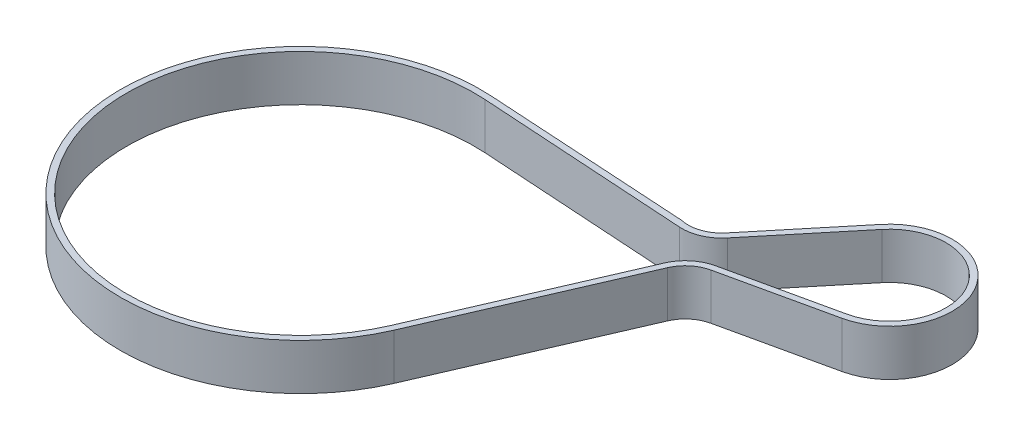
ISO-10303-21;
HEADER;
FILE_DESCRIPTION(('STEP AP214'),'2;1');
FILE_NAME('part.step','',(''),(''),'','','');
FILE_SCHEMA(('AUTOMOTIVE_DESIGN { 1 0 10303 214 1 1 1 1 }'));
ENDSEC;
DATA;
#1=APPLICATION_CONTEXT('core data for automotive mechanical design processes');
#2=APPLICATION_PROTOCOL_DEFINITION('international standard','automotive_design',2000,#1);
#3=PRODUCT_CONTEXT('',#1,'mechanical');
#4=PRODUCT('Part','Part','',(#3));
#5=PRODUCT_RELATED_PRODUCT_CATEGORY('part','',(#4));
#6=PRODUCT_DEFINITION_FORMATION('','',#4);
#7=PRODUCT_DEFINITION_CONTEXT('part definition',#1,'design');
#8=PRODUCT_DEFINITION('design','',#6,#7);
#9=PRODUCT_DEFINITION_SHAPE('','',#8);
#10=(LENGTH_UNIT() NAMED_UNIT(*) SI_UNIT(.MILLI.,.METRE.));
#11=(NAMED_UNIT(*) PLANE_ANGLE_UNIT() SI_UNIT($,.RADIAN.));
#12=(NAMED_UNIT(*) SI_UNIT($,.STERADIAN.) SOLID_ANGLE_UNIT());
#13=UNCERTAINTY_MEASURE_WITH_UNIT(LENGTH_MEASURE(1.E-05),#10,'distance_accuracy_value','');
#14=(GEOMETRIC_REPRESENTATION_CONTEXT(3) GLOBAL_UNCERTAINTY_ASSIGNED_CONTEXT((#13)) GLOBAL_UNIT_ASSIGNED_CONTEXT((#10,
#11,#12)) REPRESENTATION_CONTEXT('',''));
#15=CARTESIAN_POINT('',(0.,0.,0.));
#16=DIRECTION('',(0.,0.,1.));
#17=DIRECTION('',(1.,0.,0.));
#18=AXIS2_PLACEMENT_3D('',#15,#16,#17);
#19=CARTESIAN_POINT('',(37.0715224274978,7.,-24.207214546462));
#20=DIRECTION('',(0.,-1.,0.));
#21=DIRECTION('',(0.,0.,-1.));
#22=AXIS2_PLACEMENT_3D('',#19,#20,#21);
#23=CYLINDRICAL_SURFACE('',#22,9.17);
#24=CARTESIAN_POINT('',(37.0715224274978,0.,-24.207214546462));
#25=DIRECTION('',(0.,1.,0.));
#26=DIRECTION('',(0.,0.,1.));
#27=AXIS2_PLACEMENT_3D('',#24,#25,#26);
#28=CIRCLE('',#27,9.17);
#29=CARTESIAN_POINT('',(39.0527045898969,0.,-15.2537896576615));
#30=VERTEX_POINT('',#29);
#31=CARTESIAN_POINT('',(29.9994658756208,0.,-30.0445869114096));
#32=VERTEX_POINT('',#31);
#33=EDGE_CURVE('E263',#30,#32,#28,.T.);
#34=ORIENTED_EDGE('',*,*,#33,.F.);
#35=DIRECTION('',(0.,-1.,0.));
#36=VECTOR('',#35,1.);
#37=CARTESIAN_POINT('',(39.0527045898969,7.,-15.2537896576615));
#38=LINE('',#37,#36);
#39=CARTESIAN_POINT('',(39.0527045898969,7.5,-15.2537896576615));
#40=VERTEX_POINT('',#39);
#41=EDGE_CURVE('E11',#40,#30,#38,.T.);
#42=ORIENTED_EDGE('',*,*,#41,.F.);
#43=CARTESIAN_POINT('',(37.0715224274978,7.5,-24.207214546462));
#44=DIRECTION('',(0.,1.,0.));
#45=DIRECTION('',(0.,0.,1.));
#46=AXIS2_PLACEMENT_3D('',#43,#44,#45);
#47=CIRCLE('',#46,9.17000000000001);
#48=CARTESIAN_POINT('',(29.9994658756208,7.5,-30.0445869114096));
#49=VERTEX_POINT('',#48);
#50=EDGE_CURVE('E167',#40,#49,#47,.T.);
#51=ORIENTED_EDGE('',*,*,#50,.T.);
#52=DIRECTION('',(0.,-1.,0.));
#53=VECTOR('',#52,1.);
#54=CARTESIAN_POINT('',(29.9994658756208,7.,-30.0445869114096));
#55=LINE('',#54,#53);
#56=EDGE_CURVE('E61',#49,#32,#55,.T.);
#57=ORIENTED_EDGE('',*,*,#56,.T.);
#58=EDGE_LOOP('',(#34,#42,#51,#57));
#59=FACE_BOUND('',#58,.T.);
#60=ADVANCED_FACE('F43',(#59),#23,.F.);
#61=CARTESIAN_POINT('',(-1.39485950516736,7.,-6.30369586753306));
#62=DIRECTION('',(-0.216050399389213,0.,-0.976382212519135));
#63=DIRECTION('',(-0.976382212519135,0.,0.216050399389213));
#64=AXIS2_PLACEMENT_3D('',#61,#62,#63);
#65=PLANE('',#64);
#66=DIRECTION('',(0.976382212519135,0.,-0.216050399389213));
#67=VECTOR('',#66,1.);
#68=CARTESIAN_POINT('',(-1.39485950516736,0.,-6.30369586753306));
#69=LINE('',#68,#67);
#70=CARTESIAN_POINT('',(21.601634897573,0.,-11.3922787365768));
#71=VERTEX_POINT('',#70);
#72=EDGE_CURVE('E266',#71,#30,#69,.T.);
#73=ORIENTED_EDGE('',*,*,#72,.F.);
#74=DIRECTION('',(0.,-1.,0.));
#75=VECTOR('',#74,1.);
#76=CARTESIAN_POINT('',(21.601634897573,7.,-11.3922787365768));
#77=LINE('',#76,#75);
#78=CARTESIAN_POINT('',(21.601634897573,7.5,-11.3922787365768));
#79=VERTEX_POINT('',#78);
#80=EDGE_CURVE('E53',#79,#71,#77,.T.);
#81=ORIENTED_EDGE('',*,*,#80,.F.);
#82=DIRECTION('',(0.976382212519135,0.,-0.216050399389213));
#83=VECTOR('',#82,1.);
#84=CARTESIAN_POINT('',(21.601634897573,7.5,-11.3922787365768));
#85=LINE('',#84,#83);
#86=EDGE_CURVE('E198',#79,#40,#85,.T.);
#87=ORIENTED_EDGE('',*,*,#86,.T.);
#88=ORIENTED_EDGE('',*,*,#41,.T.);
#89=EDGE_LOOP('',(#73,#81,#87,#88));
#90=FACE_BOUND('',#89,.T.);
#91=ADVANCED_FACE('F372',(#90),#65,.T.);
#92=CARTESIAN_POINT('',(23.0059624936029,7.,-5.04579435520239));
#93=DIRECTION('',(0.,-1.,0.));
#94=DIRECTION('',(0.,0.,-1.));
#95=AXIS2_PLACEMENT_3D('',#92,#93,#94);
#96=CYLINDRICAL_SURFACE('',#95,6.5);
#97=CARTESIAN_POINT('',(23.0059624936029,0.,-5.04579435520239));
#98=DIRECTION('',(0.,1.,0.));
#99=DIRECTION('',(0.,0.,1.));
#100=AXIS2_PLACEMENT_3D('',#97,#98,#99);
#101=CIRCLE('',#100,6.5);
#102=CARTESIAN_POINT('',(17.0413153761302,0.,-7.62900645722272));
#103=VERTEX_POINT('',#102);
#104=EDGE_CURVE('E270',#71,#103,#101,.T.);
#105=ORIENTED_EDGE('',*,*,#104,.T.);
#106=DIRECTION('',(0.,-1.,0.));
#107=VECTOR('',#106,1.);
#108=CARTESIAN_POINT('',(17.0413153761302,7.,-7.62900645722272));
#109=LINE('',#108,#107);
#110=CARTESIAN_POINT('',(17.0413153761302,7.5,-7.62900645722273));
#111=VERTEX_POINT('',#110);
#112=EDGE_CURVE('E304',#111,#103,#109,.T.);
#113=ORIENTED_EDGE('',*,*,#112,.F.);
#114=CARTESIAN_POINT('',(23.0059624936029,7.5,-5.04579435520239));
#115=DIRECTION('',(0.,-1.,0.));
#116=DIRECTION('',(0.,0.,1.));
#117=AXIS2_PLACEMENT_3D('',#114,#115,#116);
#118=CIRCLE('',#117,6.5);
#119=EDGE_CURVE('E194',#111,#79,#118,.T.);
#120=ORIENTED_EDGE('',*,*,#119,.T.);
#121=ORIENTED_EDGE('',*,*,#80,.T.);
#122=EDGE_LOOP('',(#105,#113,#120,#121));
#123=FACE_BOUND('',#122,.T.);
#124=ADVANCED_FACE('F377',(#123),#96,.T.);
#125=CARTESIAN_POINT('',(11.5676165036055,7.,5.00978622123501));
#126=DIRECTION('',(0.917638018072727,0.,0.397417246464667));
#127=DIRECTION('',(0.397417246464667,0.,-0.917638018072727));
#128=AXIS2_PLACEMENT_3D('',#125,#126,#127);
#129=PLANE('',#128);
#130=DIRECTION('',(-0.397417246464667,0.,0.917638018072727));
#131=VECTOR('',#130,1.);
#132=CARTESIAN_POINT('',(11.5676165036055,0.,5.00978622123501));
#133=LINE('',#132,#131);
#134=CARTESIAN_POINT('',(3.60785055487717,0.,23.3889177624306));
#135=VERTEX_POINT('',#134);
#136=EDGE_CURVE('E274',#103,#135,#133,.T.);
#137=ORIENTED_EDGE('',*,*,#136,.T.);
#138=DIRECTION('',(0.,-1.,0.));
#139=VECTOR('',#138,1.);
#140=CARTESIAN_POINT('',(3.60785055487717,7.,23.3889177624306));
#141=LINE('',#140,#139);
#142=CARTESIAN_POINT('',(3.60785055487717,7.5,23.3889177624306));
#143=VERTEX_POINT('',#142);
#144=EDGE_CURVE('E301',#143,#135,#141,.T.);
#145=ORIENTED_EDGE('',*,*,#144,.F.);
#146=DIRECTION('',(0.397417246464667,0.,-0.917638018072727));
#147=VECTOR('',#146,1.);
#148=CARTESIAN_POINT('',(3.60785055487717,7.5,23.3889177624306));
#149=LINE('',#148,#147);
#150=EDGE_CURVE('E190',#143,#111,#149,.T.);
#151=ORIENTED_EDGE('',*,*,#150,.T.);
#152=ORIENTED_EDGE('',*,*,#112,.T.);
#153=EDGE_LOOP('',(#137,#145,#151,#152));
#154=FACE_BOUND('',#153,.T.);
#155=ADVANCED_FACE('F517',(#154),#129,.F.);
#156=CARTESIAN_POINT('',(-22.3337762160388,7.,12.1539322048745));
#157=DIRECTION('',(0.,-1.,0.));
#158=DIRECTION('',(0.,0.,-1.));
#159=AXIS2_PLACEMENT_3D('',#156,#157,#158);
#160=CYLINDRICAL_SURFACE('',#159,28.27);
#161=CARTESIAN_POINT('',(-22.3337762160388,0.,12.1539322048745));
#162=DIRECTION('',(0.,1.,0.));
#163=DIRECTION('',(0.,0.,1.));
#164=AXIS2_PLACEMENT_3D('',#161,#162,#163);
#165=CIRCLE('',#164,28.27);
#166=CARTESIAN_POINT('',(-20.5376343611678,0.,-16.0589509238875));
#167=VERTEX_POINT('',#166);
#168=EDGE_CURVE('E278',#167,#135,#165,.T.);
#169=ORIENTED_EDGE('',*,*,#168,.F.);
#170=DIRECTION('',(0.,-1.,0.));
#171=VECTOR('',#170,1.);
#172=CARTESIAN_POINT('',(-20.5376343611678,7.,-16.0589509238875));
#173=LINE('',#172,#171);
#174=CARTESIAN_POINT('',(-20.5376343611678,7.5,-16.0589509238875));
#175=VERTEX_POINT('',#174);
#176=EDGE_CURVE('E298',#175,#167,#173,.T.);
#177=ORIENTED_EDGE('',*,*,#176,.F.);
#178=CARTESIAN_POINT('',(-22.3337762160388,7.5,12.1539322048745));
#179=DIRECTION('',(0.,1.,0.));
#180=DIRECTION('',(0.,0.,1.));
#181=AXIS2_PLACEMENT_3D('',#178,#179,#180);
#182=CIRCLE('',#181,28.27);
#183=EDGE_CURVE('E186',#175,#143,#182,.T.);
#184=ORIENTED_EDGE('',*,*,#183,.T.);
#185=ORIENTED_EDGE('',*,*,#144,.T.);
#186=EDGE_LOOP('',(#169,#177,#184,#185));
#187=FACE_BOUND('',#186,.T.);
#188=ADVANCED_FACE('F505',(#187),#160,.F.);
#189=CARTESIAN_POINT('',(0.93534333914657,7.,-14.6918976588872));
#190=DIRECTION('',(-0.0635352619338865,0.,0.99797959422575));
#191=DIRECTION('',(0.99797959422575,0.,0.0635352619338865));
#192=AXIS2_PLACEMENT_3D('',#189,#190,#191);
#193=PLANE('',#192);
#194=DIRECTION('',(-0.99797959422575,0.,-0.0635352619338865));
#195=VECTOR('',#194,1.);
#196=CARTESIAN_POINT('',(0.93534333914657,0.,-14.6918976588872));
#197=LINE('',#196,#195);
#198=CARTESIAN_POINT('',(13.1959891557268,0.,-13.9113372667287));
#199=VERTEX_POINT('',#198);
#200=EDGE_CURVE('E282',#199,#167,#197,.T.);
#201=ORIENTED_EDGE('',*,*,#200,.F.);
#202=DIRECTION('',(0.,-1.,0.));
#203=VECTOR('',#202,1.);
#204=CARTESIAN_POINT('',(13.1959891557268,7.,-13.9113372667287));
#205=LINE('',#204,#203);
#206=CARTESIAN_POINT('',(13.1959891557268,7.5,-13.9113372667287));
#207=VERTEX_POINT('',#206);
#208=EDGE_CURVE('E295',#207,#199,#205,.T.);
#209=ORIENTED_EDGE('',*,*,#208,.F.);
#210=DIRECTION('',(-0.99797959422575,0.,-0.0635352619338865));
#211=VECTOR('',#210,1.);
#212=CARTESIAN_POINT('',(13.1959891557268,7.5,-13.9113372667287));
#213=LINE('',#212,#211);
#214=EDGE_CURVE('E180',#207,#175,#213,.T.);
#215=ORIENTED_EDGE('',*,*,#214,.T.);
#216=ORIENTED_EDGE('',*,*,#176,.T.);
#217=EDGE_LOOP('',(#201,#209,#215,#216));
#218=FACE_BOUND('',#217,.T.);
#219=ADVANCED_FACE('F493',(#218),#193,.T.);
#220=CARTESIAN_POINT('',(13.608968358297,7.,-20.3982046291961));
#221=DIRECTION('',(0.,-1.,0.));
#222=DIRECTION('',(0.,0.,-1.));
#223=AXIS2_PLACEMENT_3D('',#220,#221,#222);
#224=CYLINDRICAL_SURFACE('',#223,6.5);
#225=CARTESIAN_POINT('',(13.608968358297,0.,-20.3982046291961));
#226=DIRECTION('',(0.,1.,0.));
#227=DIRECTION('',(0.,0.,1.));
#228=AXIS2_PLACEMENT_3D('',#225,#226,#227);
#229=CIRCLE('',#228,6.5);
#230=CARTESIAN_POINT('',(18.6218764921248,0.,-16.260481578797));
#231=VERTEX_POINT('',#230);
#232=EDGE_CURVE('E286',#199,#231,#229,.T.);
#233=ORIENTED_EDGE('',*,*,#232,.T.);
#234=DIRECTION('',(0.,-1.,0.));
#235=VECTOR('',#234,1.);
#236=CARTESIAN_POINT('',(18.6218764921248,7.,-16.260481578797));
#237=LINE('',#236,#235);
#238=CARTESIAN_POINT('',(18.6218764921248,7.5,-16.260481578797));
#239=VERTEX_POINT('',#238);
#240=EDGE_CURVE('E164',#239,#231,#237,.T.);
#241=ORIENTED_EDGE('',*,*,#240,.F.);
#242=CARTESIAN_POINT('',(13.608968358297,7.5,-20.3982046291961));
#243=DIRECTION('',(0.,-1.,0.));
#244=DIRECTION('',(0.,0.,1.));
#245=AXIS2_PLACEMENT_3D('',#242,#243,#244);
#246=CIRCLE('',#245,6.5);
#247=EDGE_CURVE('E176',#239,#207,#246,.T.);
#248=ORIENTED_EDGE('',*,*,#247,.T.);
#249=ORIENTED_EDGE('',*,*,#208,.T.);
#250=EDGE_LOOP('',(#233,#241,#248,#249));
#251=FACE_BOUND('',#250,.T.);
#252=ADVANCED_FACE('F483',(#251),#224,.T.);
#253=CARTESIAN_POINT('',(-1.17880910577814,7.,-5.32731365501387));
#254=DIRECTION('',(0.216050399389214,0.,0.976382212519135));
#255=DIRECTION('',(0.976382212519135,0.,-0.216050399389214));
#256=AXIS2_PLACEMENT_3D('',#253,#254,#255);
#257=PLANE('',#256);
#258=DIRECTION('',(-0.976382212519135,0.,0.216050399389214));
#259=VECTOR('',#258,1.);
#260=CARTESIAN_POINT('',(-1.17880910577814,0.,-5.32731365501387));
#261=LINE('',#260,#259);
#262=CARTESIAN_POINT('',(39.2687549892861,0.,-14.2774074451424));
#263=VERTEX_POINT('',#262);
#264=CARTESIAN_POINT('',(21.8176852969622,0.,-10.4158965240576));
#265=VERTEX_POINT('',#264);
#266=EDGE_CURVE('E233',#263,#265,#261,.T.);
#267=ORIENTED_EDGE('',*,*,#266,.F.);
#268=DIRECTION('',(0.,-1.,0.));
#269=VECTOR('',#268,1.);
#270=CARTESIAN_POINT('',(39.2687549892861,7.,-14.2774074451424));
#271=LINE('',#270,#269);
#272=CARTESIAN_POINT('',(39.2687549892861,7.5,-14.2774074451424));
#273=VERTEX_POINT('',#272);
#274=EDGE_CURVE('E47',#273,#263,#271,.T.);
#275=ORIENTED_EDGE('',*,*,#274,.F.);
#276=DIRECTION('',(0.976382212519135,0.,-0.216050399389214));
#277=VECTOR('',#276,1.);
#278=CARTESIAN_POINT('',(39.2687549892861,7.5,-14.2774074451424));
#279=LINE('',#278,#277);
#280=CARTESIAN_POINT('',(21.8176852969622,7.5,-10.4158965240576));
#281=VERTEX_POINT('',#280);
#282=EDGE_CURVE('E213',#281,#273,#279,.T.);
#283=ORIENTED_EDGE('',*,*,#282,.F.);
#284=DIRECTION('',(0.,-1.,0.));
#285=VECTOR('',#284,1.);
#286=CARTESIAN_POINT('',(21.8176852969622,7.,-10.4158965240576));
#287=LINE('',#286,#285);
#288=EDGE_CURVE('E291',#281,#265,#287,.T.);
#289=ORIENTED_EDGE('',*,*,#288,.T.);
#290=EDGE_LOOP('',(#267,#275,#283,#289));
#291=FACE_BOUND('',#290,.T.);
#292=ADVANCED_FACE('F45',(#291),#257,.T.);
#293=CARTESIAN_POINT('',(37.0715224274978,7.,-24.207214546462));
#294=DIRECTION('',(0.,-1.,0.));
#295=DIRECTION('',(0.,0.,-1.));
#296=AXIS2_PLACEMENT_3D('',#293,#294,#295);
#297=CYLINDRICAL_SURFACE('',#296,10.17);
#298=CARTESIAN_POINT('',(37.0715224274978,0.,-24.207214546462));
#299=DIRECTION('',(0.,1.,0.));
#300=DIRECTION('',(0.,0.,1.));
#301=AXIS2_PLACEMENT_3D('',#298,#299,#300);
#302=CIRCLE('',#301,10.17);
#303=CARTESIAN_POINT('',(29.2282492396473,0.,-30.6811596883941));
#304=VERTEX_POINT('',#303);
#305=EDGE_CURVE('E237',#263,#304,#302,.T.);
#306=ORIENTED_EDGE('',*,*,#305,.T.);
#307=DIRECTION('',(0.,-1.,0.));
#308=VECTOR('',#307,1.);
#309=CARTESIAN_POINT('',(29.2282492396473,7.,-30.6811596883941));
#310=LINE('',#309,#308);
#311=CARTESIAN_POINT('',(29.2282492396473,7.5,-30.6811596883941));
#312=VERTEX_POINT('',#311);
#313=EDGE_CURVE('E327',#312,#304,#310,.T.);
#314=ORIENTED_EDGE('',*,*,#313,.F.);
#315=CARTESIAN_POINT('',(37.0715224274978,7.5,-24.207214546462));
#316=DIRECTION('',(0.,1.,0.));
#317=DIRECTION('',(0.,0.,1.));
#318=AXIS2_PLACEMENT_3D('',#315,#316,#317);
#319=CIRCLE('',#318,10.17);
#320=EDGE_CURVE('E217',#273,#312,#319,.T.);
#321=ORIENTED_EDGE('',*,*,#320,.F.);
#322=ORIENTED_EDGE('',*,*,#274,.T.);
#323=EDGE_LOOP('',(#306,#314,#321,#322));
#324=FACE_BOUND('',#323,.T.);
#325=ADVANCED_FACE('F337',(#324),#297,.T.);
#326=CARTESIAN_POINT('',(2.32176390132331,7.,1.91641573226963));
#327=DIRECTION('',(0.7712166359735,0.,0.636572776984468));
#328=DIRECTION('',(0.636572776984468,0.,-0.7712166359735));
#329=AXIS2_PLACEMENT_3D('',#326,#327,#328);
#330=PLANE('',#329);
#331=DIRECTION('',(-0.636572776984468,0.,0.7712166359735));
#332=VECTOR('',#331,1.);
#333=CARTESIAN_POINT('',(2.32176390132331,0.,1.91641573226963));
#334=LINE('',#333,#332);
#335=CARTESIAN_POINT('',(17.8506598561513,0.,-16.8970543557815));
#336=VERTEX_POINT('',#335);
#337=EDGE_CURVE('E240',#304,#336,#334,.T.);
#338=ORIENTED_EDGE('',*,*,#337,.T.);
#339=DIRECTION('',(0.,-1.,0.));
#340=VECTOR('',#339,1.);
#341=CARTESIAN_POINT('',(17.8506598561513,7.,-16.8970543557815));
#342=LINE('',#341,#340);
#343=CARTESIAN_POINT('',(17.8506598561513,7.5,-16.8970543557815));
#344=VERTEX_POINT('',#343);
#345=EDGE_CURVE('E325',#344,#336,#342,.T.);
#346=ORIENTED_EDGE('',*,*,#345,.F.);
#347=DIRECTION('',(-0.636572776984468,0.,0.7712166359735));
#348=VECTOR('',#347,1.);
#349=CARTESIAN_POINT('',(29.2282492396473,7.5,-30.6811596883941));
#350=LINE('',#349,#348);
#351=EDGE_CURVE('E221',#312,#344,#350,.T.);
#352=ORIENTED_EDGE('',*,*,#351,.F.);
#353=ORIENTED_EDGE('',*,*,#313,.T.);
#354=EDGE_LOOP('',(#338,#346,#352,#353));
#355=FACE_BOUND('',#354,.T.);
#356=ADVANCED_FACE('F363',(#355),#330,.F.);
#357=CARTESIAN_POINT('',(13.608968358297,7.,-20.3982046291961));
#358=DIRECTION('',(0.,-1.,0.));
#359=DIRECTION('',(0.,0.,-1.));
#360=AXIS2_PLACEMENT_3D('',#357,#358,#359);
#361=CYLINDRICAL_SURFACE('',#360,5.5);
#362=CARTESIAN_POINT('',(13.608968358297,0.,-20.3982046291961));
#363=DIRECTION('',(0.,1.,0.));
#364=DIRECTION('',(0.,0.,1.));
#365=AXIS2_PLACEMENT_3D('',#362,#363,#364);
#366=CIRCLE('',#365,5.5);
#367=CARTESIAN_POINT('',(12.3809176973598,0.,-15.0370581497412));
#368=VERTEX_POINT('',#367);
#369=EDGE_CURVE('E244',#368,#336,#366,.T.);
#370=ORIENTED_EDGE('',*,*,#369,.F.);
#371=DIRECTION('',(0.,-1.,0.));
#372=VECTOR('',#371,1.);
#373=CARTESIAN_POINT('',(12.3809176973598,7.,-15.0370581497412));
#374=LINE('',#373,#372);
#375=CARTESIAN_POINT('',(12.3809176973598,7.5,-15.0370581497412));
#376=VERTEX_POINT('',#375);
#377=EDGE_CURVE('E322',#376,#368,#374,.T.);
#378=ORIENTED_EDGE('',*,*,#377,.F.);
#379=CARTESIAN_POINT('',(13.608968358297,7.5,-20.3982046291961));
#380=DIRECTION('',(0.,-1.,0.));
#381=DIRECTION('',(0.,0.,1.));
#382=AXIS2_PLACEMENT_3D('',#379,#380,#381);
#383=CIRCLE('',#382,5.5);
#384=EDGE_CURVE('E225',#344,#376,#383,.T.);
#385=ORIENTED_EDGE('',*,*,#384,.F.);
#386=ORIENTED_EDGE('',*,*,#345,.T.);
#387=EDGE_LOOP('',(#370,#378,#385,#386));
#388=FACE_BOUND('',#387,.T.);
#389=ADVANCED_FACE('F362',(#388),#361,.F.);
#390=CARTESIAN_POINT('',(0.967625838658651,7.,-15.7387526458147));
#391=DIRECTION('',(0.0613646004397327,0.,-0.998115417080045));
#392=DIRECTION('',(-0.998115417080045,0.,-0.0613646004397327));
#393=AXIS2_PLACEMENT_3D('',#390,#391,#392);
#394=PLANE('',#393);
#395=DIRECTION('',(0.998115417080045,0.,0.0613646004397327));
#396=VECTOR('',#395,1.);
#397=CARTESIAN_POINT('',(0.967625838658651,0.,-15.7387526458147));
#398=LINE('',#397,#396);
#399=CARTESIAN_POINT('',(-20.5376343611678,0.,-17.0609060530584));
#400=VERTEX_POINT('',#399);
#401=EDGE_CURVE('E248',#400,#368,#398,.T.);
#402=ORIENTED_EDGE('',*,*,#401,.F.);
#403=DIRECTION('',(0.,-1.,0.));
#404=VECTOR('',#403,1.);
#405=CARTESIAN_POINT('',(-20.5376343611678,7.,-17.0609060530584));
#406=LINE('',#405,#404);
#407=CARTESIAN_POINT('',(-20.5376343611678,7.5,-17.0609060530584));
#408=VERTEX_POINT('',#407);
#409=EDGE_CURVE('E319',#408,#400,#406,.T.);
#410=ORIENTED_EDGE('',*,*,#409,.F.);
#411=DIRECTION('',(-0.998115417080045,0.,-0.0613646004397327));
#412=VECTOR('',#411,1.);
#413=CARTESIAN_POINT('',(-20.5376343611678,7.5,-17.0609060530584));
#414=LINE('',#413,#412);
#415=EDGE_CURVE('E229',#376,#408,#414,.T.);
#416=ORIENTED_EDGE('',*,*,#415,.F.);
#417=ORIENTED_EDGE('',*,*,#377,.T.);
#418=EDGE_LOOP('',(#402,#410,#416,#417));
#419=FACE_BOUND('',#418,.T.);
#420=ADVANCED_FACE('F357',(#419),#394,.T.);
#421=CARTESIAN_POINT('',(-22.3337762160388,7.,12.1539322048745));
#422=DIRECTION('',(0.,-1.,0.));
#423=DIRECTION('',(0.,0.,-1.));
#424=AXIS2_PLACEMENT_3D('',#421,#422,#423);
#425=CYLINDRICAL_SURFACE('',#424,29.27);
#426=CARTESIAN_POINT('',(-22.3337762160388,0.,12.1539322048745));
#427=DIRECTION('',(0.,1.,0.));
#428=DIRECTION('',(0.,0.,1.));
#429=AXIS2_PLACEMENT_3D('',#426,#427,#428);
#430=CIRCLE('',#429,29.27);
#431=CARTESIAN_POINT('',(4.52548857294989,0.,23.7863350088953));
#432=VERTEX_POINT('',#431);
#433=EDGE_CURVE('E252',#400,#432,#430,.T.);
#434=ORIENTED_EDGE('',*,*,#433,.T.);
#435=DIRECTION('',(0.,-1.,0.));
#436=VECTOR('',#435,1.);
#437=CARTESIAN_POINT('',(4.52548857294989,7.,23.7863350088953));
#438=LINE('',#437,#436);
#439=CARTESIAN_POINT('',(4.52548857294989,7.5,23.7863350088953));
#440=VERTEX_POINT('',#439);
#441=EDGE_CURVE('E315',#440,#432,#438,.T.);
#442=ORIENTED_EDGE('',*,*,#441,.F.);
#443=CARTESIAN_POINT('',(-22.3337762160388,7.5,12.1539322048745));
#444=DIRECTION('',(0.,1.,0.));
#445=DIRECTION('',(0.,0.,1.));
#446=AXIS2_PLACEMENT_3D('',#443,#444,#445);
#447=CIRCLE('',#446,29.27);
#448=EDGE_CURVE('E201',#408,#440,#447,.T.);
#449=ORIENTED_EDGE('',*,*,#448,.F.);
#450=ORIENTED_EDGE('',*,*,#409,.T.);
#451=EDGE_LOOP('',(#434,#442,#449,#450));
#452=FACE_BOUND('',#451,.T.);
#453=ADVANCED_FACE('F386',(#452),#425,.T.);
#454=CARTESIAN_POINT('',(12.4852545216783,7.,5.40720346769968));
#455=DIRECTION('',(-0.917638018072727,0.,-0.397417246464668));
#456=DIRECTION('',(-0.397417246464668,0.,0.917638018072727));
#457=AXIS2_PLACEMENT_3D('',#454,#455,#456);
#458=PLANE('',#457);
#459=DIRECTION('',(0.397417246464668,0.,-0.917638018072727));
#460=VECTOR('',#459,1.);
#461=CARTESIAN_POINT('',(12.4852545216783,0.,5.40720346769968));
#462=LINE('',#461,#460);
#463=CARTESIAN_POINT('',(17.9589533942029,0.,-7.23158921075805));
#464=VERTEX_POINT('',#463);
#465=EDGE_CURVE('E255',#432,#464,#462,.T.);
#466=ORIENTED_EDGE('',*,*,#465,.T.);
#467=DIRECTION('',(0.,-1.,0.));
#468=VECTOR('',#467,1.);
#469=CARTESIAN_POINT('',(17.9589533942029,7.,-7.23158921075805));
#470=LINE('',#469,#468);
#471=CARTESIAN_POINT('',(17.9589533942029,7.5,-7.23158921075805));
#472=VERTEX_POINT('',#471);
#473=EDGE_CURVE('E312',#472,#464,#470,.T.);
#474=ORIENTED_EDGE('',*,*,#473,.F.);
#475=DIRECTION('',(0.397417246464667,0.,-0.917638018072727));
#476=VECTOR('',#475,1.);
#477=CARTESIAN_POINT('',(4.52548857294989,7.5,23.7863350088953));
#478=LINE('',#477,#476);
#479=EDGE_CURVE('E205',#440,#472,#478,.T.);
#480=ORIENTED_EDGE('',*,*,#479,.F.);
#481=ORIENTED_EDGE('',*,*,#441,.T.);
#482=EDGE_LOOP('',(#466,#474,#480,#481));
#483=FACE_BOUND('',#482,.T.);
#484=ADVANCED_FACE('F351',(#483),#458,.F.);
#485=CARTESIAN_POINT('',(23.0059624936029,7.,-5.04579435520239));
#486=DIRECTION('',(0.,-1.,0.));
#487=DIRECTION('',(0.,0.,-1.));
#488=AXIS2_PLACEMENT_3D('',#485,#486,#487);
#489=CYLINDRICAL_SURFACE('',#488,5.5);
#490=CARTESIAN_POINT('',(23.0059624936029,0.,-5.04579435520239));
#491=DIRECTION('',(0.,1.,0.));
#492=DIRECTION('',(0.,0.,1.));
#493=AXIS2_PLACEMENT_3D('',#490,#491,#492);
#494=CIRCLE('',#493,5.5);
#495=EDGE_CURVE('E259',#265,#464,#494,.T.);
#496=ORIENTED_EDGE('',*,*,#495,.F.);
#497=ORIENTED_EDGE('',*,*,#288,.F.);
#498=CARTESIAN_POINT('',(23.0059624936029,7.5,-5.04579435520239));
#499=DIRECTION('',(0.,-1.,0.));
#500=DIRECTION('',(0.,0.,1.));
#501=AXIS2_PLACEMENT_3D('',#498,#499,#500);
#502=CIRCLE('',#501,5.49999999999998);
#503=EDGE_CURVE('E209',#472,#281,#502,.T.);
#504=ORIENTED_EDGE('',*,*,#503,.F.);
#505=ORIENTED_EDGE('',*,*,#473,.T.);
#506=EDGE_LOOP('',(#496,#497,#504,#505));
#507=FACE_BOUND('',#506,.T.);
#508=ADVANCED_FACE('F346',(#507),#489,.F.);
#509=CARTESIAN_POINT('',(3.09298053729681,7.,2.55298850925409));
#510=DIRECTION('',(-0.7712166359735,0.,-0.636572776984468));
#511=DIRECTION('',(-0.636572776984468,0.,0.7712166359735));
#512=AXIS2_PLACEMENT_3D('',#509,#510,#511);
#513=PLANE('',#512);
#514=DIRECTION('',(0.636572776984468,0.,-0.771216635973501));
#515=VECTOR('',#514,1.);
#516=CARTESIAN_POINT('',(3.09298053729681,0.,2.55298850925409));
#517=LINE('',#516,#515);
#518=EDGE_CURVE('E68',#231,#32,#517,.T.);
#519=ORIENTED_EDGE('',*,*,#518,.T.);
#520=ORIENTED_EDGE('',*,*,#56,.F.);
#521=DIRECTION('',(-0.636572776984468,0.,0.7712166359735));
#522=VECTOR('',#521,1.);
#523=CARTESIAN_POINT('',(29.9994658756208,7.5,-30.0445869114096));
#524=LINE('',#523,#522);
#525=EDGE_CURVE('E161',#49,#239,#524,.T.);
#526=ORIENTED_EDGE('',*,*,#525,.T.);
#527=ORIENTED_EDGE('',*,*,#240,.T.);
#528=EDGE_LOOP('',(#519,#520,#526,#527));
#529=FACE_BOUND('',#528,.T.);
#530=ADVANCED_FACE('F159',(#529),#513,.F.);
#531=CARTESIAN_POINT('',(0.,0.,0.));
#532=DIRECTION('',(0.,1.,0.));
#533=DIRECTION('',(0.,0.,1.));
#534=AXIS2_PLACEMENT_3D('',#531,#532,#533);
#535=PLANE('',#534);
#536=ORIENTED_EDGE('',*,*,#266,.T.);
#537=ORIENTED_EDGE('',*,*,#495,.T.);
#538=ORIENTED_EDGE('',*,*,#465,.F.);
#539=ORIENTED_EDGE('',*,*,#433,.F.);
#540=ORIENTED_EDGE('',*,*,#401,.T.);
#541=ORIENTED_EDGE('',*,*,#369,.T.);
#542=ORIENTED_EDGE('',*,*,#337,.F.);
#543=ORIENTED_EDGE('',*,*,#305,.F.);
#544=EDGE_LOOP('',(#536,#537,#538,#539,#540,#541,#542,#543));
#545=FACE_BOUND('',#544,.T.);
#546=ORIENTED_EDGE('',*,*,#33,.T.);
#547=ORIENTED_EDGE('',*,*,#518,.F.);
#548=ORIENTED_EDGE('',*,*,#232,.F.);
#549=ORIENTED_EDGE('',*,*,#200,.T.);
#550=ORIENTED_EDGE('',*,*,#168,.T.);
#551=ORIENTED_EDGE('',*,*,#136,.F.);
#552=ORIENTED_EDGE('',*,*,#104,.F.);
#553=ORIENTED_EDGE('',*,*,#72,.T.);
#554=EDGE_LOOP('',(#546,#547,#548,#549,#550,#551,#552,#553));
#555=FACE_BOUND('',#554,.T.);
#556=ADVANCED_FACE('F342',(#545,#555),#535,.F.);
#557=CARTESIAN_POINT('',(-22.3337762160388,7.5,12.1539322048745));
#558=DIRECTION('',(0.,1.,0.));
#559=DIRECTION('',(0.,0.,1.));
#560=AXIS2_PLACEMENT_3D('',#557,#558,#559);
#561=PLANE('',#560);
#562=ORIENTED_EDGE('',*,*,#448,.T.);
#563=ORIENTED_EDGE('',*,*,#479,.T.);
#564=ORIENTED_EDGE('',*,*,#503,.T.);
#565=ORIENTED_EDGE('',*,*,#282,.T.);
#566=ORIENTED_EDGE('',*,*,#320,.T.);
#567=ORIENTED_EDGE('',*,*,#351,.T.);
#568=ORIENTED_EDGE('',*,*,#384,.T.);
#569=ORIENTED_EDGE('',*,*,#415,.T.);
#570=EDGE_LOOP('',(#562,#563,#564,#565,#566,#567,#568,#569));
#571=FACE_BOUND('',#570,.T.);
#572=ORIENTED_EDGE('',*,*,#525,.F.);
#573=ORIENTED_EDGE('',*,*,#50,.F.);
#574=ORIENTED_EDGE('',*,*,#86,.F.);
#575=ORIENTED_EDGE('',*,*,#119,.F.);
#576=ORIENTED_EDGE('',*,*,#150,.F.);
#577=ORIENTED_EDGE('',*,*,#183,.F.);
#578=ORIENTED_EDGE('',*,*,#214,.F.);
#579=ORIENTED_EDGE('',*,*,#247,.F.);
#580=EDGE_LOOP('',(#572,#573,#574,#575,#576,#577,#578,#579));
#581=FACE_BOUND('',#580,.T.);
#582=ADVANCED_FACE('F173',(#571,#581),#561,.T.);
#583=CLOSED_SHELL('',(#60,#91,#124,#155,#188,#219,#252,#292,#325,#356,#389,#420,#453,#484,#508,
#530,#556,#582));
#584=MANIFOLD_SOLID_BREP('B2',#583);
#585=ADVANCED_BREP_SHAPE_REPRESENTATION('',(#18,#584),#14);
#586=SHAPE_DEFINITION_REPRESENTATION(#9,#585);
ENDSEC;
END-ISO-10303-21;
